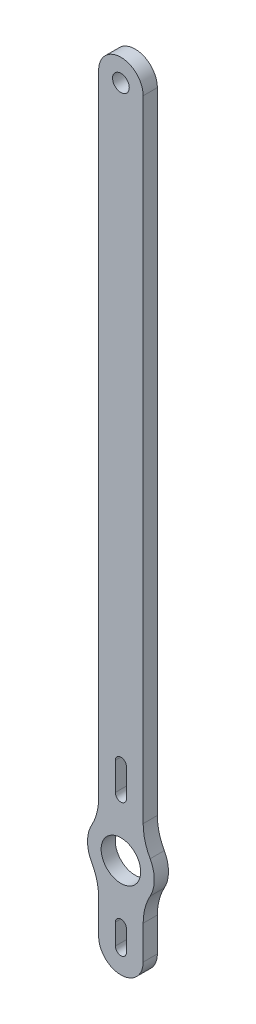
ISO-10303-21;
HEADER;
FILE_DESCRIPTION(('STEP AP214'),'2;1');
FILE_NAME('part.step','',(''),(''),'','','');
FILE_SCHEMA(('AUTOMOTIVE_DESIGN { 1 0 10303 214 1 1 1 1 }'));
ENDSEC;
DATA;
#1=APPLICATION_CONTEXT('core data for automotive mechanical design processes');
#2=APPLICATION_PROTOCOL_DEFINITION('international standard','automotive_design',2000,#1);
#3=PRODUCT_CONTEXT('',#1,'mechanical');
#4=PRODUCT('Part','Part','',(#3));
#5=PRODUCT_RELATED_PRODUCT_CATEGORY('part','',(#4));
#6=PRODUCT_DEFINITION_FORMATION('','',#4);
#7=PRODUCT_DEFINITION_CONTEXT('part definition',#1,'design');
#8=PRODUCT_DEFINITION('design','',#6,#7);
#9=PRODUCT_DEFINITION_SHAPE('','',#8);
#10=(LENGTH_UNIT() NAMED_UNIT(*) SI_UNIT(.MILLI.,.METRE.));
#11=(NAMED_UNIT(*) PLANE_ANGLE_UNIT() SI_UNIT($,.RADIAN.));
#12=(NAMED_UNIT(*) SI_UNIT($,.STERADIAN.) SOLID_ANGLE_UNIT());
#13=UNCERTAINTY_MEASURE_WITH_UNIT(LENGTH_MEASURE(1.E-05),#10,'distance_accuracy_value','');
#14=(GEOMETRIC_REPRESENTATION_CONTEXT(3) GLOBAL_UNCERTAINTY_ASSIGNED_CONTEXT((#13)) GLOBAL_UNIT_ASSIGNED_CONTEXT((#10,
#11,#12)) REPRESENTATION_CONTEXT('',''));
#15=CARTESIAN_POINT('',(0.,0.,0.));
#16=DIRECTION('',(0.,0.,1.));
#17=DIRECTION('',(1.,0.,0.));
#18=AXIS2_PLACEMENT_3D('',#15,#16,#17);
#19=CARTESIAN_POINT('',(0.,121.,2.55));
#20=DIRECTION('',(0.,0.,1.));
#21=DIRECTION('',(1.,0.,0.));
#22=AXIS2_PLACEMENT_3D('',#19,#20,#21);
#23=PLANE('',#22);
#24=DIRECTION('',(0.,-1.,0.));
#25=VECTOR('',#24,1.);
#26=CARTESIAN_POINT('',(-0.999999999999998,-10.1,2.55));
#27=LINE('',#26,#25);
#28=CARTESIAN_POINT('',(-0.999999999999998,-10.1,2.55));
#29=VERTEX_POINT('',#28);
#30=CARTESIAN_POINT('',(-0.999999999999998,-13.8,2.55));
#31=VERTEX_POINT('',#30);
#32=EDGE_CURVE('E210',#29,#31,#27,.T.);
#33=ORIENTED_EDGE('',*,*,#32,.F.);
#34=CARTESIAN_POINT('',(0.,-10.1,2.55));
#35=DIRECTION('',(0.,0.,1.));
#36=DIRECTION('',(1.,0.,0.));
#37=AXIS2_PLACEMENT_3D('',#34,#35,#36);
#38=CIRCLE('',#37,0.999999999999998);
#39=CARTESIAN_POINT('',(0.999999999999998,-10.1,2.55));
#40=VERTEX_POINT('',#39);
#41=EDGE_CURVE('E208',#40,#29,#38,.T.);
#42=ORIENTED_EDGE('',*,*,#41,.F.);
#43=DIRECTION('',(0.,1.,0.));
#44=VECTOR('',#43,1.);
#45=CARTESIAN_POINT('',(0.999999999999998,-10.1,2.55));
#46=LINE('',#45,#44);
#47=CARTESIAN_POINT('',(0.999999999999998,-13.8,2.55));
#48=VERTEX_POINT('',#47);
#49=EDGE_CURVE('E216',#48,#40,#46,.T.);
#50=ORIENTED_EDGE('',*,*,#49,.F.);
#51=CARTESIAN_POINT('',(0.,-13.8,2.55));
#52=DIRECTION('',(0.,0.,1.));
#53=DIRECTION('',(1.,0.,0.));
#54=AXIS2_PLACEMENT_3D('',#51,#52,#53);
#55=CIRCLE('',#54,0.999999999999998);
#56=EDGE_CURVE('E213',#31,#48,#55,.T.);
#57=ORIENTED_EDGE('',*,*,#56,.F.);
#58=EDGE_LOOP('',(#33,#42,#50,#57));
#59=FACE_BOUND('',#58,.T.);
#60=CARTESIAN_POINT('',(0.,0.,2.55));
#61=DIRECTION('',(0.,0.,1.));
#62=DIRECTION('',(1.,0.,0.));
#63=AXIS2_PLACEMENT_3D('',#60,#61,#62);
#64=CIRCLE('',#63,3.55);
#65=CARTESIAN_POINT('',(3.55,0.,2.55));
#66=VERTEX_POINT('',#65);
#67=EDGE_CURVE('E245',#66,#66,#64,.T.);
#68=ORIENTED_EDGE('',*,*,#67,.F.);
#69=EDGE_LOOP('',(#68));
#70=FACE_BOUND('',#69,.T.);
#71=CARTESIAN_POINT('',(0.,121.,2.55));
#72=DIRECTION('',(0.,0.,1.));
#73=DIRECTION('',(1.,0.,0.));
#74=AXIS2_PLACEMENT_3D('',#71,#72,#73);
#75=CIRCLE('',#74,4.);
#76=CARTESIAN_POINT('',(4.,121.,2.55));
#77=VERTEX_POINT('',#76);
#78=CARTESIAN_POINT('',(-4.,121.,2.55));
#79=VERTEX_POINT('',#78);
#80=EDGE_CURVE('E251',#77,#79,#75,.T.);
#81=ORIENTED_EDGE('',*,*,#80,.T.);
#82=DIRECTION('',(0.,-1.,0.));
#83=VECTOR('',#82,1.);
#84=CARTESIAN_POINT('',(-4.,121.,2.55));
#85=LINE('',#84,#83);
#86=CARTESIAN_POINT('',(-4.,7.74596669241484,2.55));
#87=VERTEX_POINT('',#86);
#88=EDGE_CURVE('E254',#79,#87,#85,.T.);
#89=ORIENTED_EDGE('',*,*,#88,.T.);
#90=CARTESIAN_POINT('',(-14.,7.74596669241484,2.55));
#91=DIRECTION('',(0.,0.,-1.));
#92=DIRECTION('',(1.,0.,0.));
#93=AXIS2_PLACEMENT_3D('',#90,#91,#92);
#94=CIRCLE('',#93,10.);
#95=CARTESIAN_POINT('',(-5.25,2.90473750965557,2.55));
#96=VERTEX_POINT('',#95);
#97=EDGE_CURVE('E257',#87,#96,#94,.T.);
#98=ORIENTED_EDGE('',*,*,#97,.T.);
#99=CARTESIAN_POINT('',(0.,0.,2.55));
#100=DIRECTION('',(0.,0.,1.));
#101=DIRECTION('',(1.,0.,0.));
#102=AXIS2_PLACEMENT_3D('',#99,#100,#101);
#103=CIRCLE('',#102,6.);
#104=CARTESIAN_POINT('',(-5.25,-2.90473750965557,2.55));
#105=VERTEX_POINT('',#104);
#106=EDGE_CURVE('E259',#96,#105,#103,.T.);
#107=ORIENTED_EDGE('',*,*,#106,.T.);
#108=CARTESIAN_POINT('',(-14.,-7.74596669241484,2.55));
#109=DIRECTION('',(0.,0.,-1.));
#110=DIRECTION('',(-1.,0.,0.));
#111=AXIS2_PLACEMENT_3D('',#108,#109,#110);
#112=CIRCLE('',#111,10.);
#113=CARTESIAN_POINT('',(-4.,-7.74596669241484,2.55));
#114=VERTEX_POINT('',#113);
#115=EDGE_CURVE('E261',#105,#114,#112,.T.);
#116=ORIENTED_EDGE('',*,*,#115,.T.);
#117=DIRECTION('',(0.,-1.,0.));
#118=VECTOR('',#117,1.);
#119=CARTESIAN_POINT('',(-4.,-7.74596669241484,2.55));
#120=LINE('',#119,#118);
#121=CARTESIAN_POINT('',(-4.,-13.8,2.55));
#122=VERTEX_POINT('',#121);
#123=EDGE_CURVE('E263',#114,#122,#120,.T.);
#124=ORIENTED_EDGE('',*,*,#123,.T.);
#125=CARTESIAN_POINT('',(0.,-13.8,2.55));
#126=DIRECTION('',(0.,0.,1.));
#127=DIRECTION('',(1.,0.,0.));
#128=AXIS2_PLACEMENT_3D('',#125,#126,#127);
#129=CIRCLE('',#128,4.);
#130=CARTESIAN_POINT('',(4.,-13.8,2.55));
#131=VERTEX_POINT('',#130);
#132=EDGE_CURVE('E265',#122,#131,#129,.T.);
#133=ORIENTED_EDGE('',*,*,#132,.T.);
#134=DIRECTION('',(0.,1.,0.));
#135=VECTOR('',#134,1.);
#136=CARTESIAN_POINT('',(4.,-7.74596669241483,2.55));
#137=LINE('',#136,#135);
#138=CARTESIAN_POINT('',(4.,-7.74596669241483,2.55));
#139=VERTEX_POINT('',#138);
#140=EDGE_CURVE('E267',#131,#139,#137,.T.);
#141=ORIENTED_EDGE('',*,*,#140,.T.);
#142=CARTESIAN_POINT('',(14.,-7.74596669241483,2.55));
#143=DIRECTION('',(0.,0.,-1.));
#144=DIRECTION('',(1.,0.,0.));
#145=AXIS2_PLACEMENT_3D('',#142,#143,#144);
#146=CIRCLE('',#145,10.);
#147=CARTESIAN_POINT('',(5.25,-2.90473750965556,2.55));
#148=VERTEX_POINT('',#147);
#149=EDGE_CURVE('E269',#139,#148,#146,.T.);
#150=ORIENTED_EDGE('',*,*,#149,.T.);
#151=CARTESIAN_POINT('',(0.,0.,2.55));
#152=DIRECTION('',(0.,0.,1.));
#153=DIRECTION('',(1.,0.,0.));
#154=AXIS2_PLACEMENT_3D('',#151,#152,#153);
#155=CIRCLE('',#154,6.);
#156=CARTESIAN_POINT('',(5.25,2.90473750965556,2.55));
#157=VERTEX_POINT('',#156);
#158=EDGE_CURVE('E271',#148,#157,#155,.T.);
#159=ORIENTED_EDGE('',*,*,#158,.T.);
#160=CARTESIAN_POINT('',(14.,7.74596669241483,2.55));
#161=DIRECTION('',(0.,0.,-1.));
#162=DIRECTION('',(1.,0.,0.));
#163=AXIS2_PLACEMENT_3D('',#160,#161,#162);
#164=CIRCLE('',#163,10.);
#165=CARTESIAN_POINT('',(4.,7.74596669241483,2.55));
#166=VERTEX_POINT('',#165);
#167=EDGE_CURVE('E273',#157,#166,#164,.T.);
#168=ORIENTED_EDGE('',*,*,#167,.T.);
#169=DIRECTION('',(0.,1.,0.));
#170=VECTOR('',#169,1.);
#171=CARTESIAN_POINT('',(4.,121.,2.55));
#172=LINE('',#171,#170);
#173=EDGE_CURVE('E275',#166,#77,#172,.T.);
#174=ORIENTED_EDGE('',*,*,#173,.T.);
#175=EDGE_LOOP('',(#81,#89,#98,#107,#116,#124,#133,#141,#150,#159,#168,#174));
#176=FACE_BOUND('',#175,.T.);
#177=CARTESIAN_POINT('',(0.,121.,2.55));
#178=DIRECTION('',(0.,0.,1.));
#179=DIRECTION('',(1.,0.,0.));
#180=AXIS2_PLACEMENT_3D('',#177,#178,#179);
#181=CIRCLE('',#180,1.5);
#182=CARTESIAN_POINT('',(1.5,121.,2.55));
#183=VERTEX_POINT('',#182);
#184=EDGE_CURVE('E239',#183,#183,#181,.T.);
#185=ORIENTED_EDGE('',*,*,#184,.F.);
#186=EDGE_LOOP('',(#185));
#187=FACE_BOUND('',#186,.T.);
#188=DIRECTION('',(0.,-1.,0.));
#189=VECTOR('',#188,1.);
#190=CARTESIAN_POINT('',(-0.999999999999998,15.1,2.55));
#191=LINE('',#190,#189);
#192=CARTESIAN_POINT('',(-0.999999999999998,15.1,2.55));
#193=VERTEX_POINT('',#192);
#194=CARTESIAN_POINT('',(-0.999999999999998,10.1,2.55));
#195=VERTEX_POINT('',#194);
#196=EDGE_CURVE('E180',#193,#195,#191,.T.);
#197=ORIENTED_EDGE('',*,*,#196,.F.);
#198=CARTESIAN_POINT('',(0.,15.1,2.55));
#199=DIRECTION('',(0.,0.,1.));
#200=DIRECTION('',(1.,0.,0.));
#201=AXIS2_PLACEMENT_3D('',#198,#199,#200);
#202=CIRCLE('',#201,0.999999999999998);
#203=CARTESIAN_POINT('',(0.999999999999998,15.1,2.55));
#204=VERTEX_POINT('',#203);
#205=EDGE_CURVE('E172',#204,#193,#202,.T.);
#206=ORIENTED_EDGE('',*,*,#205,.F.);
#207=DIRECTION('',(0.,1.,0.));
#208=VECTOR('',#207,1.);
#209=CARTESIAN_POINT('',(0.999999999999998,15.1,2.55));
#210=LINE('',#209,#208);
#211=CARTESIAN_POINT('',(0.999999999999998,10.1,2.55));
#212=VERTEX_POINT('',#211);
#213=EDGE_CURVE('E194',#212,#204,#210,.T.);
#214=ORIENTED_EDGE('',*,*,#213,.F.);
#215=CARTESIAN_POINT('',(0.,10.1,2.55));
#216=DIRECTION('',(0.,0.,1.));
#217=DIRECTION('',(1.,0.,0.));
#218=AXIS2_PLACEMENT_3D('',#215,#216,#217);
#219=CIRCLE('',#218,0.999999999999998);
#220=EDGE_CURVE('E192',#195,#212,#219,.T.);
#221=ORIENTED_EDGE('',*,*,#220,.F.);
#222=EDGE_LOOP('',(#197,#206,#214,#221));
#223=FACE_BOUND('',#222,.T.);
#224=ADVANCED_FACE('F35',(#59,#70,#176,#187,#223),#23,.T.);
#225=CARTESIAN_POINT('',(0.,121.,0.));
#226=DIRECTION('',(0.,0.,1.));
#227=DIRECTION('',(1.,0.,0.));
#228=AXIS2_PLACEMENT_3D('',#225,#226,#227);
#229=PLANE('',#228);
#230=CARTESIAN_POINT('',(0.,-10.1,0.));
#231=DIRECTION('',(0.,0.,1.));
#232=DIRECTION('',(1.,0.,0.));
#233=AXIS2_PLACEMENT_3D('',#230,#231,#232);
#234=CIRCLE('',#233,0.999999999999998);
#235=CARTESIAN_POINT('',(0.999999999999998,-10.1,0.));
#236=VERTEX_POINT('',#235);
#237=CARTESIAN_POINT('',(-0.999999999999998,-10.1,0.));
#238=VERTEX_POINT('',#237);
#239=EDGE_CURVE('E188',#236,#238,#234,.T.);
#240=ORIENTED_EDGE('',*,*,#239,.T.);
#241=DIRECTION('',(0.,-1.,0.));
#242=VECTOR('',#241,1.);
#243=CARTESIAN_POINT('',(-0.999999999999998,-10.1,0.));
#244=LINE('',#243,#242);
#245=CARTESIAN_POINT('',(-0.999999999999998,-13.8,0.));
#246=VERTEX_POINT('',#245);
#247=EDGE_CURVE('E221',#238,#246,#244,.T.);
#248=ORIENTED_EDGE('',*,*,#247,.T.);
#249=CARTESIAN_POINT('',(0.,-13.8,0.));
#250=DIRECTION('',(0.,0.,1.));
#251=DIRECTION('',(1.,0.,0.));
#252=AXIS2_PLACEMENT_3D('',#249,#250,#251);
#253=CIRCLE('',#252,0.999999999999998);
#254=CARTESIAN_POINT('',(0.999999999999998,-13.8,0.));
#255=VERTEX_POINT('',#254);
#256=EDGE_CURVE('E224',#246,#255,#253,.T.);
#257=ORIENTED_EDGE('',*,*,#256,.T.);
#258=DIRECTION('',(0.,1.,0.));
#259=VECTOR('',#258,1.);
#260=CARTESIAN_POINT('',(0.999999999999998,-10.1,0.));
#261=LINE('',#260,#259);
#262=EDGE_CURVE('E211',#255,#236,#261,.T.);
#263=ORIENTED_EDGE('',*,*,#262,.T.);
#264=EDGE_LOOP('',(#240,#248,#257,#263));
#265=FACE_BOUND('',#264,.T.);
#266=CARTESIAN_POINT('',(0.,0.,0.));
#267=DIRECTION('',(0.,0.,1.));
#268=DIRECTION('',(1.,0.,0.));
#269=AXIS2_PLACEMENT_3D('',#266,#267,#268);
#270=CIRCLE('',#269,3.55);
#271=CARTESIAN_POINT('',(3.55,0.,0.));
#272=VERTEX_POINT('',#271);
#273=EDGE_CURVE('E242',#272,#272,#270,.T.);
#274=ORIENTED_EDGE('',*,*,#273,.T.);
#275=EDGE_LOOP('',(#274));
#276=FACE_BOUND('',#275,.T.);
#277=CARTESIAN_POINT('',(0.,121.,0.));
#278=DIRECTION('',(0.,0.,1.));
#279=DIRECTION('',(1.,0.,0.));
#280=AXIS2_PLACEMENT_3D('',#277,#278,#279);
#281=CIRCLE('',#280,4.);
#282=CARTESIAN_POINT('',(4.,121.,0.));
#283=VERTEX_POINT('',#282);
#284=CARTESIAN_POINT('',(-4.,121.,0.));
#285=VERTEX_POINT('',#284);
#286=EDGE_CURVE('E248',#283,#285,#281,.T.);
#287=ORIENTED_EDGE('',*,*,#286,.F.);
#288=DIRECTION('',(0.,1.,0.));
#289=VECTOR('',#288,1.);
#290=CARTESIAN_POINT('',(4.,121.,0.));
#291=LINE('',#290,#289);
#292=CARTESIAN_POINT('',(4.,7.74596669241483,0.));
#293=VERTEX_POINT('',#292);
#294=EDGE_CURVE('E255',#293,#283,#291,.T.);
#295=ORIENTED_EDGE('',*,*,#294,.F.);
#296=CARTESIAN_POINT('',(14.,7.74596669241483,0.));
#297=DIRECTION('',(0.,0.,-1.));
#298=DIRECTION('',(1.,0.,0.));
#299=AXIS2_PLACEMENT_3D('',#296,#297,#298);
#300=CIRCLE('',#299,10.);
#301=CARTESIAN_POINT('',(5.25,2.90473750965556,0.));
#302=VERTEX_POINT('',#301);
#303=EDGE_CURVE('E298',#302,#293,#300,.T.);
#304=ORIENTED_EDGE('',*,*,#303,.F.);
#305=CARTESIAN_POINT('',(0.,0.,0.));
#306=DIRECTION('',(0.,0.,1.));
#307=DIRECTION('',(1.,0.,0.));
#308=AXIS2_PLACEMENT_3D('',#305,#306,#307);
#309=CIRCLE('',#308,6.);
#310=CARTESIAN_POINT('',(5.25,-2.90473750965556,0.));
#311=VERTEX_POINT('',#310);
#312=EDGE_CURVE('E296',#311,#302,#309,.T.);
#313=ORIENTED_EDGE('',*,*,#312,.F.);
#314=CARTESIAN_POINT('',(14.,-7.74596669241483,0.));
#315=DIRECTION('',(0.,0.,-1.));
#316=DIRECTION('',(1.,0.,0.));
#317=AXIS2_PLACEMENT_3D('',#314,#315,#316);
#318=CIRCLE('',#317,10.);
#319=CARTESIAN_POINT('',(4.,-7.74596669241483,0.));
#320=VERTEX_POINT('',#319);
#321=EDGE_CURVE('E294',#320,#311,#318,.T.);
#322=ORIENTED_EDGE('',*,*,#321,.F.);
#323=DIRECTION('',(0.,1.,0.));
#324=VECTOR('',#323,1.);
#325=CARTESIAN_POINT('',(4.,-7.74596669241483,0.));
#326=LINE('',#325,#324);
#327=CARTESIAN_POINT('',(4.,-13.8,0.));
#328=VERTEX_POINT('',#327);
#329=EDGE_CURVE('E292',#328,#320,#326,.T.);
#330=ORIENTED_EDGE('',*,*,#329,.F.);
#331=CARTESIAN_POINT('',(0.,-13.8,0.));
#332=DIRECTION('',(0.,0.,1.));
#333=DIRECTION('',(1.,0.,0.));
#334=AXIS2_PLACEMENT_3D('',#331,#332,#333);
#335=CIRCLE('',#334,4.);
#336=CARTESIAN_POINT('',(-4.,-13.8,0.));
#337=VERTEX_POINT('',#336);
#338=EDGE_CURVE('E290',#337,#328,#335,.T.);
#339=ORIENTED_EDGE('',*,*,#338,.F.);
#340=DIRECTION('',(0.,-1.,0.));
#341=VECTOR('',#340,1.);
#342=CARTESIAN_POINT('',(-4.,-7.74596669241484,0.));
#343=LINE('',#342,#341);
#344=CARTESIAN_POINT('',(-4.,-7.74596669241484,0.));
#345=VERTEX_POINT('',#344);
#346=EDGE_CURVE('E288',#345,#337,#343,.T.);
#347=ORIENTED_EDGE('',*,*,#346,.F.);
#348=CARTESIAN_POINT('',(-14.,-7.74596669241484,0.));
#349=DIRECTION('',(0.,0.,-1.));
#350=DIRECTION('',(-1.,0.,0.));
#351=AXIS2_PLACEMENT_3D('',#348,#349,#350);
#352=CIRCLE('',#351,10.);
#353=CARTESIAN_POINT('',(-5.25,-2.90473750965557,0.));
#354=VERTEX_POINT('',#353);
#355=EDGE_CURVE('E286',#354,#345,#352,.T.);
#356=ORIENTED_EDGE('',*,*,#355,.F.);
#357=CARTESIAN_POINT('',(0.,0.,0.));
#358=DIRECTION('',(0.,0.,1.));
#359=DIRECTION('',(1.,0.,0.));
#360=AXIS2_PLACEMENT_3D('',#357,#358,#359);
#361=CIRCLE('',#360,6.);
#362=CARTESIAN_POINT('',(-5.25,2.90473750965557,0.));
#363=VERTEX_POINT('',#362);
#364=EDGE_CURVE('E284',#363,#354,#361,.T.);
#365=ORIENTED_EDGE('',*,*,#364,.F.);
#366=CARTESIAN_POINT('',(-14.,7.74596669241484,0.));
#367=DIRECTION('',(0.,0.,-1.));
#368=DIRECTION('',(1.,0.,0.));
#369=AXIS2_PLACEMENT_3D('',#366,#367,#368);
#370=CIRCLE('',#369,10.);
#371=CARTESIAN_POINT('',(-4.,7.74596669241484,0.));
#372=VERTEX_POINT('',#371);
#373=EDGE_CURVE('E282',#372,#363,#370,.T.);
#374=ORIENTED_EDGE('',*,*,#373,.F.);
#375=DIRECTION('',(0.,-1.,0.));
#376=VECTOR('',#375,1.);
#377=CARTESIAN_POINT('',(-4.,121.,0.));
#378=LINE('',#377,#376);
#379=EDGE_CURVE('E280',#285,#372,#378,.T.);
#380=ORIENTED_EDGE('',*,*,#379,.F.);
#381=EDGE_LOOP('',(#287,#295,#304,#313,#322,#330,#339,#347,#356,#365,#374,#380));
#382=FACE_BOUND('',#381,.T.);
#383=CARTESIAN_POINT('',(0.,121.,0.));
#384=DIRECTION('',(0.,0.,1.));
#385=DIRECTION('',(1.,0.,0.));
#386=AXIS2_PLACEMENT_3D('',#383,#384,#385);
#387=CIRCLE('',#386,1.5);
#388=CARTESIAN_POINT('',(1.5,121.,0.));
#389=VERTEX_POINT('',#388);
#390=EDGE_CURVE('E238',#389,#389,#387,.T.);
#391=ORIENTED_EDGE('',*,*,#390,.T.);
#392=EDGE_LOOP('',(#391));
#393=FACE_BOUND('',#392,.T.);
#394=CARTESIAN_POINT('',(0.,15.1,0.));
#395=DIRECTION('',(0.,0.,1.));
#396=DIRECTION('',(1.,0.,0.));
#397=AXIS2_PLACEMENT_3D('',#394,#395,#396);
#398=CIRCLE('',#397,0.999999999999998);
#399=CARTESIAN_POINT('',(0.999999999999998,15.1,0.));
#400=VERTEX_POINT('',#399);
#401=CARTESIAN_POINT('',(-0.999999999999998,15.1,0.));
#402=VERTEX_POINT('',#401);
#403=EDGE_CURVE('E58',#400,#402,#398,.T.);
#404=ORIENTED_EDGE('',*,*,#403,.T.);
#405=DIRECTION('',(0.,-1.,0.));
#406=VECTOR('',#405,1.);
#407=CARTESIAN_POINT('',(-0.999999999999998,15.1,0.));
#408=LINE('',#407,#406);
#409=CARTESIAN_POINT('',(-0.999999999999998,10.1,0.));
#410=VERTEX_POINT('',#409);
#411=EDGE_CURVE('E187',#402,#410,#408,.T.);
#412=ORIENTED_EDGE('',*,*,#411,.T.);
#413=CARTESIAN_POINT('',(0.,10.1,0.));
#414=DIRECTION('',(0.,0.,1.));
#415=DIRECTION('',(1.,0.,0.));
#416=AXIS2_PLACEMENT_3D('',#413,#414,#415);
#417=CIRCLE('',#416,0.999999999999998);
#418=CARTESIAN_POINT('',(0.999999999999998,10.1,0.));
#419=VERTEX_POINT('',#418);
#420=EDGE_CURVE('E200',#410,#419,#417,.T.);
#421=ORIENTED_EDGE('',*,*,#420,.T.);
#422=DIRECTION('',(0.,1.,0.));
#423=VECTOR('',#422,1.);
#424=CARTESIAN_POINT('',(0.999999999999998,15.1,0.));
#425=LINE('',#424,#423);
#426=EDGE_CURVE('E181',#419,#400,#425,.T.);
#427=ORIENTED_EDGE('',*,*,#426,.T.);
#428=EDGE_LOOP('',(#404,#412,#421,#427));
#429=FACE_BOUND('',#428,.T.);
#430=ADVANCED_FACE('F340',(#265,#276,#382,#393,#429),#229,.F.);
#431=CARTESIAN_POINT('',(0.,121.,2.55));
#432=DIRECTION('',(0.,0.,-1.));
#433=DIRECTION('',(-1.,0.,0.));
#434=AXIS2_PLACEMENT_3D('',#431,#432,#433);
#435=CYLINDRICAL_SURFACE('',#434,4.);
#436=ORIENTED_EDGE('',*,*,#286,.T.);
#437=DIRECTION('',(0.,0.,-1.));
#438=VECTOR('',#437,1.);
#439=CARTESIAN_POINT('',(-4.,121.,2.55));
#440=LINE('',#439,#438);
#441=EDGE_CURVE('E11',#79,#285,#440,.T.);
#442=ORIENTED_EDGE('',*,*,#441,.F.);
#443=ORIENTED_EDGE('',*,*,#80,.F.);
#444=DIRECTION('',(0.,0.,-1.));
#445=VECTOR('',#444,1.);
#446=CARTESIAN_POINT('',(4.,121.,2.55));
#447=LINE('',#446,#445);
#448=EDGE_CURVE('E277',#77,#283,#447,.T.);
#449=ORIENTED_EDGE('',*,*,#448,.T.);
#450=EDGE_LOOP('',(#436,#442,#443,#449));
#451=FACE_BOUND('',#450,.T.);
#452=ADVANCED_FACE('F37',(#451),#435,.T.);
#453=CARTESIAN_POINT('',(-4.,121.,2.55));
#454=DIRECTION('',(1.,0.,0.));
#455=DIRECTION('',(0.,1.,0.));
#456=AXIS2_PLACEMENT_3D('',#453,#454,#455);
#457=PLANE('',#456);
#458=ORIENTED_EDGE('',*,*,#379,.T.);
#459=DIRECTION('',(0.,0.,-1.));
#460=VECTOR('',#459,1.);
#461=CARTESIAN_POINT('',(-4.,7.74596669241484,2.55));
#462=LINE('',#461,#460);
#463=EDGE_CURVE('E43',#87,#372,#462,.T.);
#464=ORIENTED_EDGE('',*,*,#463,.F.);
#465=ORIENTED_EDGE('',*,*,#88,.F.);
#466=ORIENTED_EDGE('',*,*,#441,.T.);
#467=EDGE_LOOP('',(#458,#464,#465,#466));
#468=FACE_BOUND('',#467,.T.);
#469=ADVANCED_FACE('F358',(#468),#457,.F.);
#470=CARTESIAN_POINT('',(-14.,7.74596669241484,2.55));
#471=DIRECTION('',(0.,0.,-1.));
#472=DIRECTION('',(-1.,0.,0.));
#473=AXIS2_PLACEMENT_3D('',#470,#471,#472);
#474=CYLINDRICAL_SURFACE('',#473,10.);
#475=ORIENTED_EDGE('',*,*,#373,.T.);
#476=DIRECTION('',(0.,0.,-1.));
#477=VECTOR('',#476,1.);
#478=CARTESIAN_POINT('',(-5.25,2.90473750965557,2.55));
#479=LINE('',#478,#477);
#480=EDGE_CURVE('E327',#96,#363,#479,.T.);
#481=ORIENTED_EDGE('',*,*,#480,.F.);
#482=ORIENTED_EDGE('',*,*,#97,.F.);
#483=ORIENTED_EDGE('',*,*,#463,.T.);
#484=EDGE_LOOP('',(#475,#481,#482,#483));
#485=FACE_BOUND('',#484,.T.);
#486=ADVANCED_FACE('F334',(#485),#474,.F.);
#487=CARTESIAN_POINT('',(0.,0.,2.55));
#488=DIRECTION('',(0.,0.,-1.));
#489=DIRECTION('',(-1.,0.,0.));
#490=AXIS2_PLACEMENT_3D('',#487,#488,#489);
#491=CYLINDRICAL_SURFACE('',#490,6.);
#492=ORIENTED_EDGE('',*,*,#364,.T.);
#493=DIRECTION('',(0.,0.,-1.));
#494=VECTOR('',#493,1.);
#495=CARTESIAN_POINT('',(-5.25,-2.90473750965557,2.55));
#496=LINE('',#495,#494);
#497=EDGE_CURVE('E324',#105,#354,#496,.T.);
#498=ORIENTED_EDGE('',*,*,#497,.F.);
#499=ORIENTED_EDGE('',*,*,#106,.F.);
#500=ORIENTED_EDGE('',*,*,#480,.T.);
#501=EDGE_LOOP('',(#492,#498,#499,#500));
#502=FACE_BOUND('',#501,.T.);
#503=ADVANCED_FACE('F346',(#502),#491,.T.);
#504=CARTESIAN_POINT('',(-14.,-7.74596669241484,2.55));
#505=DIRECTION('',(0.,0.,-1.));
#506=DIRECTION('',(-1.,0.,0.));
#507=AXIS2_PLACEMENT_3D('',#504,#505,#506);
#508=CYLINDRICAL_SURFACE('',#507,10.);
#509=ORIENTED_EDGE('',*,*,#355,.T.);
#510=DIRECTION('',(0.,0.,-1.));
#511=VECTOR('',#510,1.);
#512=CARTESIAN_POINT('',(-4.,-7.74596669241484,2.55));
#513=LINE('',#512,#511);
#514=EDGE_CURVE('E321',#114,#345,#513,.T.);
#515=ORIENTED_EDGE('',*,*,#514,.F.);
#516=ORIENTED_EDGE('',*,*,#115,.F.);
#517=ORIENTED_EDGE('',*,*,#497,.T.);
#518=EDGE_LOOP('',(#509,#515,#516,#517));
#519=FACE_BOUND('',#518,.T.);
#520=ADVANCED_FACE('F350',(#519),#508,.F.);
#521=CARTESIAN_POINT('',(-4.,-7.74596669241484,2.55));
#522=DIRECTION('',(1.,0.,0.));
#523=DIRECTION('',(0.,1.,0.));
#524=AXIS2_PLACEMENT_3D('',#521,#522,#523);
#525=PLANE('',#524);
#526=ORIENTED_EDGE('',*,*,#346,.T.);
#527=DIRECTION('',(0.,0.,-1.));
#528=VECTOR('',#527,1.);
#529=CARTESIAN_POINT('',(-4.,-13.8,2.55));
#530=LINE('',#529,#528);
#531=EDGE_CURVE('E318',#122,#337,#530,.T.);
#532=ORIENTED_EDGE('',*,*,#531,.F.);
#533=ORIENTED_EDGE('',*,*,#123,.F.);
#534=ORIENTED_EDGE('',*,*,#514,.T.);
#535=EDGE_LOOP('',(#526,#532,#533,#534));
#536=FACE_BOUND('',#535,.T.);
#537=ADVANCED_FACE('F391',(#536),#525,.F.);
#538=CARTESIAN_POINT('',(0.,-13.8,2.55));
#539=DIRECTION('',(0.,0.,-1.));
#540=DIRECTION('',(-1.,0.,0.));
#541=AXIS2_PLACEMENT_3D('',#538,#539,#540);
#542=CYLINDRICAL_SURFACE('',#541,4.);
#543=ORIENTED_EDGE('',*,*,#338,.T.);
#544=DIRECTION('',(0.,0.,-1.));
#545=VECTOR('',#544,1.);
#546=CARTESIAN_POINT('',(4.,-13.8,2.55));
#547=LINE('',#546,#545);
#548=EDGE_CURVE('E315',#131,#328,#547,.T.);
#549=ORIENTED_EDGE('',*,*,#548,.F.);
#550=ORIENTED_EDGE('',*,*,#132,.F.);
#551=ORIENTED_EDGE('',*,*,#531,.T.);
#552=EDGE_LOOP('',(#543,#549,#550,#551));
#553=FACE_BOUND('',#552,.T.);
#554=ADVANCED_FACE('F389',(#553),#542,.T.);
#555=CARTESIAN_POINT('',(4.,-7.74596669241483,2.55));
#556=DIRECTION('',(-1.,0.,0.));
#557=DIRECTION('',(0.,-1.,0.));
#558=AXIS2_PLACEMENT_3D('',#555,#556,#557);
#559=PLANE('',#558);
#560=ORIENTED_EDGE('',*,*,#329,.T.);
#561=DIRECTION('',(0.,0.,-1.));
#562=VECTOR('',#561,1.);
#563=CARTESIAN_POINT('',(4.,-7.74596669241483,2.55));
#564=LINE('',#563,#562);
#565=EDGE_CURVE('E312',#139,#320,#564,.T.);
#566=ORIENTED_EDGE('',*,*,#565,.F.);
#567=ORIENTED_EDGE('',*,*,#140,.F.);
#568=ORIENTED_EDGE('',*,*,#548,.T.);
#569=EDGE_LOOP('',(#560,#566,#567,#568));
#570=FACE_BOUND('',#569,.T.);
#571=ADVANCED_FACE('F385',(#570),#559,.F.);
#572=CARTESIAN_POINT('',(14.,-7.74596669241483,2.55));
#573=DIRECTION('',(0.,0.,-1.));
#574=DIRECTION('',(-1.,0.,0.));
#575=AXIS2_PLACEMENT_3D('',#572,#573,#574);
#576=CYLINDRICAL_SURFACE('',#575,10.);
#577=ORIENTED_EDGE('',*,*,#321,.T.);
#578=DIRECTION('',(0.,0.,-1.));
#579=VECTOR('',#578,1.);
#580=CARTESIAN_POINT('',(5.25,-2.90473750965556,2.55));
#581=LINE('',#580,#579);
#582=EDGE_CURVE('E309',#148,#311,#581,.T.);
#583=ORIENTED_EDGE('',*,*,#582,.F.);
#584=ORIENTED_EDGE('',*,*,#149,.F.);
#585=ORIENTED_EDGE('',*,*,#565,.T.);
#586=EDGE_LOOP('',(#577,#583,#584,#585));
#587=FACE_BOUND('',#586,.T.);
#588=ADVANCED_FACE('F380',(#587),#576,.F.);
#589=CARTESIAN_POINT('',(0.,0.,2.55));
#590=DIRECTION('',(0.,0.,-1.));
#591=DIRECTION('',(-1.,0.,0.));
#592=AXIS2_PLACEMENT_3D('',#589,#590,#591);
#593=CYLINDRICAL_SURFACE('',#592,6.);
#594=ORIENTED_EDGE('',*,*,#312,.T.);
#595=DIRECTION('',(0.,0.,-1.));
#596=VECTOR('',#595,1.);
#597=CARTESIAN_POINT('',(5.25,2.90473750965556,2.55));
#598=LINE('',#597,#596);
#599=EDGE_CURVE('E306',#157,#302,#598,.T.);
#600=ORIENTED_EDGE('',*,*,#599,.F.);
#601=ORIENTED_EDGE('',*,*,#158,.F.);
#602=ORIENTED_EDGE('',*,*,#582,.T.);
#603=EDGE_LOOP('',(#594,#600,#601,#602));
#604=FACE_BOUND('',#603,.T.);
#605=ADVANCED_FACE('F374',(#604),#593,.T.);
#606=CARTESIAN_POINT('',(14.,7.74596669241483,2.55));
#607=DIRECTION('',(0.,0.,-1.));
#608=DIRECTION('',(-1.,0.,0.));
#609=AXIS2_PLACEMENT_3D('',#606,#607,#608);
#610=CYLINDRICAL_SURFACE('',#609,10.);
#611=ORIENTED_EDGE('',*,*,#303,.T.);
#612=DIRECTION('',(0.,0.,-1.));
#613=VECTOR('',#612,1.);
#614=CARTESIAN_POINT('',(4.,7.74596669241483,2.55));
#615=LINE('',#614,#613);
#616=EDGE_CURVE('E303',#166,#293,#615,.T.);
#617=ORIENTED_EDGE('',*,*,#616,.F.);
#618=ORIENTED_EDGE('',*,*,#167,.F.);
#619=ORIENTED_EDGE('',*,*,#599,.T.);
#620=EDGE_LOOP('',(#611,#617,#618,#619));
#621=FACE_BOUND('',#620,.T.);
#622=ADVANCED_FACE('F370',(#621),#610,.F.);
#623=CARTESIAN_POINT('',(4.,121.,2.55));
#624=DIRECTION('',(-1.,0.,0.));
#625=DIRECTION('',(0.,-1.,0.));
#626=AXIS2_PLACEMENT_3D('',#623,#624,#625);
#627=PLANE('',#626);
#628=ORIENTED_EDGE('',*,*,#294,.T.);
#629=ORIENTED_EDGE('',*,*,#448,.F.);
#630=ORIENTED_EDGE('',*,*,#173,.F.);
#631=ORIENTED_EDGE('',*,*,#616,.T.);
#632=EDGE_LOOP('',(#628,#629,#630,#631));
#633=FACE_BOUND('',#632,.T.);
#634=ADVANCED_FACE('F365',(#633),#627,.F.);
#635=CARTESIAN_POINT('',(0.,0.,2.55));
#636=DIRECTION('',(0.,0.,-1.));
#637=DIRECTION('',(-1.,0.,0.));
#638=AXIS2_PLACEMENT_3D('',#635,#636,#637);
#639=CYLINDRICAL_SURFACE('',#638,3.55);
#640=ORIENTED_EDGE('',*,*,#67,.T.);
#641=EDGE_LOOP('',(#640));
#642=FACE_BOUND('',#641,.T.);
#643=ORIENTED_EDGE('',*,*,#273,.F.);
#644=EDGE_LOOP('',(#643));
#645=FACE_BOUND('',#644,.T.);
#646=ADVANCED_FACE('F411',(#642,#645),#639,.F.);
#647=CARTESIAN_POINT('',(0.,121.,2.55));
#648=DIRECTION('',(0.,0.,-1.));
#649=DIRECTION('',(-1.,0.,0.));
#650=AXIS2_PLACEMENT_3D('',#647,#648,#649);
#651=CYLINDRICAL_SURFACE('',#650,1.5);
#652=ORIENTED_EDGE('',*,*,#184,.T.);
#653=EDGE_LOOP('',(#652));
#654=FACE_BOUND('',#653,.T.);
#655=ORIENTED_EDGE('',*,*,#390,.F.);
#656=EDGE_LOOP('',(#655));
#657=FACE_BOUND('',#656,.T.);
#658=ADVANCED_FACE('F449',(#654,#657),#651,.F.);
#659=CARTESIAN_POINT('',(0.,-10.1,2.55));
#660=DIRECTION('',(0.,0.,-1.));
#661=DIRECTION('',(-1.,0.,0.));
#662=AXIS2_PLACEMENT_3D('',#659,#660,#661);
#663=CYLINDRICAL_SURFACE('',#662,0.999999999999998);
#664=ORIENTED_EDGE('',*,*,#239,.F.);
#665=DIRECTION('',(0.,0.,-1.));
#666=VECTOR('',#665,1.);
#667=CARTESIAN_POINT('',(0.999999999999998,-10.1,2.55));
#668=LINE('',#667,#666);
#669=EDGE_CURVE('E218',#40,#236,#668,.T.);
#670=ORIENTED_EDGE('',*,*,#669,.F.);
#671=ORIENTED_EDGE('',*,*,#41,.T.);
#672=DIRECTION('',(0.,0.,-1.));
#673=VECTOR('',#672,1.);
#674=CARTESIAN_POINT('',(-0.999999999999998,-10.1,2.55));
#675=LINE('',#674,#673);
#676=EDGE_CURVE('E235',#29,#238,#675,.T.);
#677=ORIENTED_EDGE('',*,*,#676,.T.);
#678=EDGE_LOOP('',(#664,#670,#671,#677));
#679=FACE_BOUND('',#678,.T.);
#680=ADVANCED_FACE('F456',(#679),#663,.F.);
#681=CARTESIAN_POINT('',(-0.999999999999998,-10.1,2.55));
#682=DIRECTION('',(1.,0.,0.));
#683=DIRECTION('',(0.,0.,-1.));
#684=AXIS2_PLACEMENT_3D('',#681,#682,#683);
#685=PLANE('',#684);
#686=ORIENTED_EDGE('',*,*,#247,.F.);
#687=ORIENTED_EDGE('',*,*,#676,.F.);
#688=ORIENTED_EDGE('',*,*,#32,.T.);
#689=DIRECTION('',(0.,0.,-1.));
#690=VECTOR('',#689,1.);
#691=CARTESIAN_POINT('',(-0.999999999999998,-13.8,2.55));
#692=LINE('',#691,#690);
#693=EDGE_CURVE('E233',#31,#246,#692,.T.);
#694=ORIENTED_EDGE('',*,*,#693,.T.);
#695=EDGE_LOOP('',(#686,#687,#688,#694));
#696=FACE_BOUND('',#695,.T.);
#697=ADVANCED_FACE('F463',(#696),#685,.T.);
#698=CARTESIAN_POINT('',(0.,-13.8,2.55));
#699=DIRECTION('',(0.,0.,-1.));
#700=DIRECTION('',(-1.,0.,0.));
#701=AXIS2_PLACEMENT_3D('',#698,#699,#700);
#702=CYLINDRICAL_SURFACE('',#701,0.999999999999998);
#703=ORIENTED_EDGE('',*,*,#256,.F.);
#704=ORIENTED_EDGE('',*,*,#693,.F.);
#705=ORIENTED_EDGE('',*,*,#56,.T.);
#706=DIRECTION('',(0.,0.,-1.));
#707=VECTOR('',#706,1.);
#708=CARTESIAN_POINT('',(0.999999999999998,-13.8,2.55));
#709=LINE('',#708,#707);
#710=EDGE_CURVE('E231',#48,#255,#709,.T.);
#711=ORIENTED_EDGE('',*,*,#710,.T.);
#712=EDGE_LOOP('',(#703,#704,#705,#711));
#713=FACE_BOUND('',#712,.T.);
#714=ADVANCED_FACE('F471',(#713),#702,.F.);
#715=CARTESIAN_POINT('',(0.999999999999998,-10.1,2.55));
#716=DIRECTION('',(-1.,0.,0.));
#717=DIRECTION('',(0.,0.,1.));
#718=AXIS2_PLACEMENT_3D('',#715,#716,#717);
#719=PLANE('',#718);
#720=ORIENTED_EDGE('',*,*,#262,.F.);
#721=ORIENTED_EDGE('',*,*,#710,.F.);
#722=ORIENTED_EDGE('',*,*,#49,.T.);
#723=ORIENTED_EDGE('',*,*,#669,.T.);
#724=EDGE_LOOP('',(#720,#721,#722,#723));
#725=FACE_BOUND('',#724,.T.);
#726=ADVANCED_FACE('F479',(#725),#719,.T.);
#727=CARTESIAN_POINT('',(0.,15.1,2.55));
#728=DIRECTION('',(0.,0.,-1.));
#729=DIRECTION('',(-1.,0.,0.));
#730=AXIS2_PLACEMENT_3D('',#727,#728,#729);
#731=CYLINDRICAL_SURFACE('',#730,0.999999999999998);
#732=ORIENTED_EDGE('',*,*,#403,.F.);
#733=DIRECTION('',(0.,0.,-1.));
#734=VECTOR('',#733,1.);
#735=CARTESIAN_POINT('',(0.999999999999998,15.1,2.55));
#736=LINE('',#735,#734);
#737=EDGE_CURVE('E176',#204,#400,#736,.T.);
#738=ORIENTED_EDGE('',*,*,#737,.F.);
#739=ORIENTED_EDGE('',*,*,#205,.T.);
#740=DIRECTION('',(0.,0.,-1.));
#741=VECTOR('',#740,1.);
#742=CARTESIAN_POINT('',(-0.999999999999998,15.1,2.55));
#743=LINE('',#742,#741);
#744=EDGE_CURVE('E175',#193,#402,#743,.T.);
#745=ORIENTED_EDGE('',*,*,#744,.T.);
#746=EDGE_LOOP('',(#732,#738,#739,#745));
#747=FACE_BOUND('',#746,.T.);
#748=ADVANCED_FACE('F174',(#747),#731,.F.);
#749=CARTESIAN_POINT('',(-0.999999999999998,15.1,2.55));
#750=DIRECTION('',(1.,0.,0.));
#751=DIRECTION('',(0.,1.,0.));
#752=AXIS2_PLACEMENT_3D('',#749,#750,#751);
#753=PLANE('',#752);
#754=ORIENTED_EDGE('',*,*,#411,.F.);
#755=ORIENTED_EDGE('',*,*,#744,.F.);
#756=ORIENTED_EDGE('',*,*,#196,.T.);
#757=DIRECTION('',(0.,0.,-1.));
#758=VECTOR('',#757,1.);
#759=CARTESIAN_POINT('',(-0.999999999999998,10.1,2.55));
#760=LINE('',#759,#758);
#761=EDGE_CURVE('E189',#195,#410,#760,.T.);
#762=ORIENTED_EDGE('',*,*,#761,.T.);
#763=EDGE_LOOP('',(#754,#755,#756,#762));
#764=FACE_BOUND('',#763,.T.);
#765=ADVANCED_FACE('F184',(#764),#753,.T.);
#766=CARTESIAN_POINT('',(0.,10.1,2.55));
#767=DIRECTION('',(0.,0.,-1.));
#768=DIRECTION('',(-1.,0.,0.));
#769=AXIS2_PLACEMENT_3D('',#766,#767,#768);
#770=CYLINDRICAL_SURFACE('',#769,0.999999999999998);
#771=ORIENTED_EDGE('',*,*,#420,.F.);
#772=ORIENTED_EDGE('',*,*,#761,.F.);
#773=ORIENTED_EDGE('',*,*,#220,.T.);
#774=DIRECTION('',(0.,0.,-1.));
#775=VECTOR('',#774,1.);
#776=CARTESIAN_POINT('',(0.999999999999998,10.1,2.55));
#777=LINE('',#776,#775);
#778=EDGE_CURVE('E50',#212,#419,#777,.T.);
#779=ORIENTED_EDGE('',*,*,#778,.T.);
#780=EDGE_LOOP('',(#771,#772,#773,#779));
#781=FACE_BOUND('',#780,.T.);
#782=ADVANCED_FACE('F500',(#781),#770,.F.);
#783=CARTESIAN_POINT('',(0.999999999999998,15.1,2.55));
#784=DIRECTION('',(-1.,0.,0.));
#785=DIRECTION('',(0.,-1.,0.));
#786=AXIS2_PLACEMENT_3D('',#783,#784,#785);
#787=PLANE('',#786);
#788=ORIENTED_EDGE('',*,*,#426,.F.);
#789=ORIENTED_EDGE('',*,*,#778,.F.);
#790=ORIENTED_EDGE('',*,*,#213,.T.);
#791=ORIENTED_EDGE('',*,*,#737,.T.);
#792=EDGE_LOOP('',(#788,#789,#790,#791));
#793=FACE_BOUND('',#792,.T.);
#794=ADVANCED_FACE('F507',(#793),#787,.T.);
#795=CLOSED_SHELL('',(#224,#430,#452,#469,#486,#503,#520,#537,#554,#571,#588,#605,#622,#634,
#646,#658,#680,#697,#714,#726,#748,#765,#782,#794));
#796=MANIFOLD_SOLID_BREP('B2',#795);
#797=ADVANCED_BREP_SHAPE_REPRESENTATION('',(#18,#796),#14);
#798=SHAPE_DEFINITION_REPRESENTATION(#9,#797);
ENDSEC;
END-ISO-10303-21;
